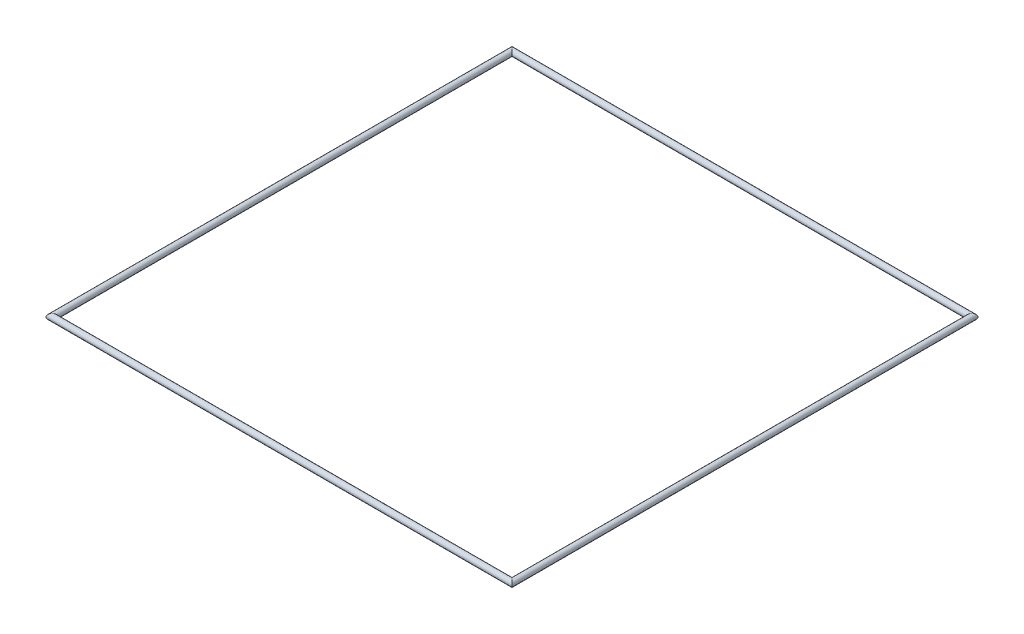
ISO-10303-21;
HEADER;
FILE_DESCRIPTION(('STEP AP214'),'2;1');
FILE_NAME('part.step','',(''),(''),'','','');
FILE_SCHEMA(('AUTOMOTIVE_DESIGN { 1 0 10303 214 1 1 1 1 }'));
ENDSEC;
DATA;
#1=APPLICATION_CONTEXT('core data for automotive mechanical design processes');
#2=APPLICATION_PROTOCOL_DEFINITION('international standard','automotive_design',2000,#1);
#3=PRODUCT_CONTEXT('',#1,'mechanical');
#4=PRODUCT('Part','Part','',(#3));
#5=PRODUCT_RELATED_PRODUCT_CATEGORY('part','',(#4));
#6=PRODUCT_DEFINITION_FORMATION('','',#4);
#7=PRODUCT_DEFINITION_CONTEXT('part definition',#1,'design');
#8=PRODUCT_DEFINITION('design','',#6,#7);
#9=PRODUCT_DEFINITION_SHAPE('','',#8);
#10=(LENGTH_UNIT() NAMED_UNIT(*) SI_UNIT(.MILLI.,.METRE.));
#11=(NAMED_UNIT(*) PLANE_ANGLE_UNIT() SI_UNIT($,.RADIAN.));
#12=(NAMED_UNIT(*) SI_UNIT($,.STERADIAN.) SOLID_ANGLE_UNIT());
#13=UNCERTAINTY_MEASURE_WITH_UNIT(LENGTH_MEASURE(1.E-05),#10,'distance_accuracy_value','');
#14=(GEOMETRIC_REPRESENTATION_CONTEXT(3) GLOBAL_UNCERTAINTY_ASSIGNED_CONTEXT((#13)) GLOBAL_UNIT_ASSIGNED_CONTEXT((#10,
#11,#12)) REPRESENTATION_CONTEXT('',''));
#15=CARTESIAN_POINT('',(0.,0.,0.));
#16=DIRECTION('',(0.,0.,1.));
#17=DIRECTION('',(1.,0.,0.));
#18=AXIS2_PLACEMENT_3D('',#15,#16,#17);
#19=CARTESIAN_POINT('',(150.,0.,-150.));
#20=DIRECTION('',(0.,0.,1.));
#21=DIRECTION('',(1.,0.,0.));
#22=AXIS2_PLACEMENT_3D('',#19,#20,#21);
#23=CYLINDRICAL_SURFACE('',#22,0.999999999999998);
#24=CARTESIAN_POINT('',(150.,0.,-150.));
#25=DIRECTION('',(-0.707106781186548,0.,-0.707106781186548));
#26=DIRECTION('',(-0.707106781186548,0.,0.707106781186548));
#27=AXIS2_PLACEMENT_3D('',#24,#25,#26);
#28=ELLIPSE('',#27,1.41421356237309,0.999999999999998);
#29=CARTESIAN_POINT('',(149.,0.,-149.));
#30=VERTEX_POINT('',#29);
#31=EDGE_CURVE('E69',#30,#30,#28,.T.);
#32=ORIENTED_EDGE('',*,*,#31,.T.);
#33=EDGE_LOOP('',(#32));
#34=FACE_BOUND('',#33,.T.);
#35=CARTESIAN_POINT('',(150.,0.,150.));
#36=DIRECTION('',(-0.707106781186548,0.,0.707106781186548));
#37=DIRECTION('',(0.707106781186548,0.,0.707106781186548));
#38=AXIS2_PLACEMENT_3D('',#35,#36,#37);
#39=ELLIPSE('',#38,1.41421356237309,0.999999999999998);
#40=CARTESIAN_POINT('',(151.,0.,151.));
#41=VERTEX_POINT('',#40);
#42=EDGE_CURVE('E59',#41,#41,#39,.T.);
#43=ORIENTED_EDGE('',*,*,#42,.T.);
#44=EDGE_LOOP('',(#43));
#45=FACE_BOUND('',#44,.T.);
#46=ADVANCED_FACE('F55',(#34,#45),#23,.F.);
#47=CARTESIAN_POINT('',(150.,0.,-150.));
#48=DIRECTION('',(0.,0.,1.));
#49=DIRECTION('',(1.,0.,0.));
#50=AXIS2_PLACEMENT_3D('',#47,#48,#49);
#51=CYLINDRICAL_SURFACE('',#50,2.);
#52=CARTESIAN_POINT('',(150.,0.,-150.));
#53=DIRECTION('',(-0.707106781186548,0.,-0.707106781186548));
#54=DIRECTION('',(-0.707106781186548,0.,0.707106781186548));
#55=AXIS2_PLACEMENT_3D('',#52,#53,#54);
#56=ELLIPSE('',#55,2.82842712474618,2.);
#57=CARTESIAN_POINT('',(148.,0.,-148.));
#58=VERTEX_POINT('',#57);
#59=EDGE_CURVE('E63',#58,#58,#56,.T.);
#60=ORIENTED_EDGE('',*,*,#59,.F.);
#61=EDGE_LOOP('',(#60));
#62=FACE_BOUND('',#61,.T.);
#63=CARTESIAN_POINT('',(150.,0.,150.));
#64=DIRECTION('',(-0.707106781186548,0.,0.707106781186548));
#65=DIRECTION('',(0.707106781186548,0.,0.707106781186548));
#66=AXIS2_PLACEMENT_3D('',#63,#64,#65);
#67=ELLIPSE('',#66,2.82842712474618,2.);
#68=CARTESIAN_POINT('',(152.,0.,152.));
#69=VERTEX_POINT('',#68);
#70=EDGE_CURVE('E12',#69,#69,#67,.T.);
#71=ORIENTED_EDGE('',*,*,#70,.F.);
#72=EDGE_LOOP('',(#71));
#73=FACE_BOUND('',#72,.T.);
#74=ADVANCED_FACE('F82',(#62,#73),#51,.T.);
#75=CARTESIAN_POINT('',(150.,0.,-150.));
#76=DIRECTION('',(-0.707106781186548,0.,-0.707106781186548));
#77=DIRECTION('',(-0.707106781186548,0.,0.707106781186548));
#78=AXIS2_PLACEMENT_3D('',#75,#76,#77);
#79=PLANE('',#78);
#80=ORIENTED_EDGE('',*,*,#31,.F.);
#81=EDGE_LOOP('',(#80));
#82=FACE_BOUND('',#81,.T.);
#83=ORIENTED_EDGE('',*,*,#59,.T.);
#84=EDGE_LOOP('',(#83));
#85=FACE_BOUND('',#84,.T.);
#86=ADVANCED_FACE('F78',(#82,#85),#79,.T.);
#87=CARTESIAN_POINT('',(150.,0.,150.));
#88=DIRECTION('',(-0.707106781186548,0.,0.707106781186548));
#89=DIRECTION('',(0.707106781186548,0.,0.707106781186548));
#90=AXIS2_PLACEMENT_3D('',#87,#88,#89);
#91=PLANE('',#90);
#92=ORIENTED_EDGE('',*,*,#42,.F.);
#93=EDGE_LOOP('',(#92));
#94=FACE_BOUND('',#93,.T.);
#95=ORIENTED_EDGE('',*,*,#70,.T.);
#96=EDGE_LOOP('',(#95));
#97=FACE_BOUND('',#96,.T.);
#98=ADVANCED_FACE('F57',(#94,#97),#91,.T.);
#99=CLOSED_SHELL('',(#46,#74,#86,#98));
#100=MANIFOLD_SOLID_BREP('B2',#99);
#101=CARTESIAN_POINT('',(150.,0.,150.));
#102=DIRECTION('',(-1.,0.,0.));
#103=DIRECTION('',(0.,0.,1.));
#104=AXIS2_PLACEMENT_3D('',#101,#102,#103);
#105=CYLINDRICAL_SURFACE('',#104,0.999999999999998);
#106=CARTESIAN_POINT('',(-150.,0.,150.));
#107=DIRECTION('',(-0.707106781186548,0.,-0.707106781186548));
#108=DIRECTION('',(-0.707106781186547,0.,0.707106781186548));
#109=AXIS2_PLACEMENT_3D('',#106,#107,#108);
#110=ELLIPSE('',#109,1.41421356237309,0.999999999999998);
#111=CARTESIAN_POINT('',(-151.,0.,151.));
#112=VERTEX_POINT('',#111);
#113=EDGE_CURVE('E168',#112,#112,#110,.T.);
#114=ORIENTED_EDGE('',*,*,#113,.T.);
#115=EDGE_LOOP('',(#114));
#116=FACE_BOUND('',#115,.T.);
#117=CARTESIAN_POINT('',(150.,0.,150.));
#118=DIRECTION('',(0.707106781186547,0.,-0.707106781186548));
#119=DIRECTION('',(-0.707106781186547,0.,-0.707106781186548));
#120=AXIS2_PLACEMENT_3D('',#117,#118,#119);
#121=ELLIPSE('',#120,1.41421356237309,0.999999999999998);
#122=CARTESIAN_POINT('',(149.,0.,149.));
#123=VERTEX_POINT('',#122);
#124=EDGE_CURVE('E156',#123,#123,#121,.T.);
#125=ORIENTED_EDGE('',*,*,#124,.T.);
#126=EDGE_LOOP('',(#125));
#127=FACE_BOUND('',#126,.T.);
#128=ADVANCED_FACE('F152',(#116,#127),#105,.F.);
#129=CARTESIAN_POINT('',(150.,0.,150.));
#130=DIRECTION('',(-1.,0.,0.));
#131=DIRECTION('',(0.,0.,1.));
#132=AXIS2_PLACEMENT_3D('',#129,#130,#131);
#133=CYLINDRICAL_SURFACE('',#132,2.);
#134=CARTESIAN_POINT('',(-150.,0.,150.));
#135=DIRECTION('',(-0.707106781186548,0.,-0.707106781186548));
#136=DIRECTION('',(-0.707106781186547,0.,0.707106781186548));
#137=AXIS2_PLACEMENT_3D('',#134,#135,#136);
#138=ELLIPSE('',#137,2.82842712474618,2.);
#139=CARTESIAN_POINT('',(-152.,0.,152.));
#140=VERTEX_POINT('',#139);
#141=EDGE_CURVE('E161',#140,#140,#138,.T.);
#142=ORIENTED_EDGE('',*,*,#141,.F.);
#143=EDGE_LOOP('',(#142));
#144=FACE_BOUND('',#143,.T.);
#145=CARTESIAN_POINT('',(150.,0.,150.));
#146=DIRECTION('',(0.707106781186547,0.,-0.707106781186548));
#147=DIRECTION('',(-0.707106781186547,0.,-0.707106781186548));
#148=AXIS2_PLACEMENT_3D('',#145,#146,#147);
#149=ELLIPSE('',#148,2.82842712474618,2.);
#150=CARTESIAN_POINT('',(148.,0.,148.));
#151=VERTEX_POINT('',#150);
#152=EDGE_CURVE('E54',#151,#151,#149,.T.);
#153=ORIENTED_EDGE('',*,*,#152,.F.);
#154=EDGE_LOOP('',(#153));
#155=FACE_BOUND('',#154,.T.);
#156=ADVANCED_FACE('F183',(#144,#155),#133,.T.);
#157=CARTESIAN_POINT('',(-150.,0.,150.));
#158=DIRECTION('',(-0.707106781186548,0.,-0.707106781186548));
#159=DIRECTION('',(-0.707106781186547,0.,0.707106781186548));
#160=AXIS2_PLACEMENT_3D('',#157,#158,#159);
#161=PLANE('',#160);
#162=ORIENTED_EDGE('',*,*,#113,.F.);
#163=EDGE_LOOP('',(#162));
#164=FACE_BOUND('',#163,.T.);
#165=ORIENTED_EDGE('',*,*,#141,.T.);
#166=EDGE_LOOP('',(#165));
#167=FACE_BOUND('',#166,.T.);
#168=ADVANCED_FACE('F179',(#164,#167),#161,.T.);
#169=CARTESIAN_POINT('',(150.,0.,150.));
#170=DIRECTION('',(0.707106781186547,0.,-0.707106781186548));
#171=DIRECTION('',(-0.707106781186547,0.,-0.707106781186548));
#172=AXIS2_PLACEMENT_3D('',#169,#170,#171);
#173=PLANE('',#172);
#174=ORIENTED_EDGE('',*,*,#124,.F.);
#175=EDGE_LOOP('',(#174));
#176=FACE_BOUND('',#175,.T.);
#177=ORIENTED_EDGE('',*,*,#152,.T.);
#178=EDGE_LOOP('',(#177));
#179=FACE_BOUND('',#178,.T.);
#180=ADVANCED_FACE('F154',(#176,#179),#173,.T.);
#181=CLOSED_SHELL('',(#128,#156,#168,#180));
#182=MANIFOLD_SOLID_BREP('B7',#181);
#183=CARTESIAN_POINT('',(-150.,0.,-150.));
#184=DIRECTION('',(1.,0.,0.));
#185=DIRECTION('',(0.,0.,-1.));
#186=AXIS2_PLACEMENT_3D('',#183,#184,#185);
#187=CYLINDRICAL_SURFACE('',#186,0.999999999999998);
#188=CARTESIAN_POINT('',(-150.,0.,-150.));
#189=DIRECTION('',(-0.707106781186547,0.,0.707106781186548));
#190=DIRECTION('',(0.707106781186548,0.,0.707106781186547));
#191=AXIS2_PLACEMENT_3D('',#188,#189,#190);
#192=ELLIPSE('',#191,1.41421356237309,0.999999999999998);
#193=CARTESIAN_POINT('',(-149.,0.,-149.));
#194=VERTEX_POINT('',#193);
#195=EDGE_CURVE('E266',#194,#194,#192,.T.);
#196=ORIENTED_EDGE('',*,*,#195,.T.);
#197=EDGE_LOOP('',(#196));
#198=FACE_BOUND('',#197,.T.);
#199=CARTESIAN_POINT('',(150.,0.,-150.));
#200=DIRECTION('',(0.707106781186548,0.,0.707106781186548));
#201=DIRECTION('',(0.707106781186547,0.,-0.707106781186548));
#202=AXIS2_PLACEMENT_3D('',#199,#200,#201);
#203=ELLIPSE('',#202,1.41421356237309,0.999999999999998);
#204=CARTESIAN_POINT('',(151.,0.,-151.));
#205=VERTEX_POINT('',#204);
#206=EDGE_CURVE('E256',#205,#205,#203,.T.);
#207=ORIENTED_EDGE('',*,*,#206,.T.);
#208=EDGE_LOOP('',(#207));
#209=FACE_BOUND('',#208,.T.);
#210=ADVANCED_FACE('F252',(#198,#209),#187,.F.);
#211=CARTESIAN_POINT('',(-150.,0.,-150.));
#212=DIRECTION('',(1.,0.,0.));
#213=DIRECTION('',(0.,0.,-1.));
#214=AXIS2_PLACEMENT_3D('',#211,#212,#213);
#215=CYLINDRICAL_SURFACE('',#214,2.);
#216=CARTESIAN_POINT('',(-150.,0.,-150.));
#217=DIRECTION('',(-0.707106781186547,0.,0.707106781186548));
#218=DIRECTION('',(0.707106781186548,0.,0.707106781186547));
#219=AXIS2_PLACEMENT_3D('',#216,#217,#218);
#220=ELLIPSE('',#219,2.82842712474618,2.);
#221=CARTESIAN_POINT('',(-148.,0.,-148.));
#222=VERTEX_POINT('',#221);
#223=EDGE_CURVE('E260',#222,#222,#220,.T.);
#224=ORIENTED_EDGE('',*,*,#223,.F.);
#225=EDGE_LOOP('',(#224));
#226=FACE_BOUND('',#225,.T.);
#227=CARTESIAN_POINT('',(150.,0.,-150.));
#228=DIRECTION('',(0.707106781186548,0.,0.707106781186548));
#229=DIRECTION('',(0.707106781186547,0.,-0.707106781186548));
#230=AXIS2_PLACEMENT_3D('',#227,#228,#229);
#231=ELLIPSE('',#230,2.82842712474618,2.);
#232=CARTESIAN_POINT('',(152.,0.,-152.));
#233=VERTEX_POINT('',#232);
#234=EDGE_CURVE('E151',#233,#233,#231,.T.);
#235=ORIENTED_EDGE('',*,*,#234,.F.);
#236=EDGE_LOOP('',(#235));
#237=FACE_BOUND('',#236,.T.);
#238=ADVANCED_FACE('F279',(#226,#237),#215,.T.);
#239=CARTESIAN_POINT('',(-150.,0.,-150.));
#240=DIRECTION('',(-0.707106781186547,0.,0.707106781186548));
#241=DIRECTION('',(0.707106781186548,0.,0.707106781186547));
#242=AXIS2_PLACEMENT_3D('',#239,#240,#241);
#243=PLANE('',#242);
#244=ORIENTED_EDGE('',*,*,#195,.F.);
#245=EDGE_LOOP('',(#244));
#246=FACE_BOUND('',#245,.T.);
#247=ORIENTED_EDGE('',*,*,#223,.T.);
#248=EDGE_LOOP('',(#247));
#249=FACE_BOUND('',#248,.T.);
#250=ADVANCED_FACE('F275',(#246,#249),#243,.T.);
#251=CARTESIAN_POINT('',(150.,0.,-150.));
#252=DIRECTION('',(0.707106781186548,0.,0.707106781186548));
#253=DIRECTION('',(0.707106781186547,0.,-0.707106781186548));
#254=AXIS2_PLACEMENT_3D('',#251,#252,#253);
#255=PLANE('',#254);
#256=ORIENTED_EDGE('',*,*,#206,.F.);
#257=EDGE_LOOP('',(#256));
#258=FACE_BOUND('',#257,.T.);
#259=ORIENTED_EDGE('',*,*,#234,.T.);
#260=EDGE_LOOP('',(#259));
#261=FACE_BOUND('',#260,.T.);
#262=ADVANCED_FACE('F254',(#258,#261),#255,.T.);
#263=CLOSED_SHELL('',(#210,#238,#250,#262));
#264=MANIFOLD_SOLID_BREP('B49',#263);
#265=CARTESIAN_POINT('',(-150.,0.,150.));
#266=DIRECTION('',(0.,0.,-1.));
#267=DIRECTION('',(-1.,0.,0.));
#268=AXIS2_PLACEMENT_3D('',#265,#266,#267);
#269=CYLINDRICAL_SURFACE('',#268,0.999999999999998);
#270=CARTESIAN_POINT('',(-150.,0.,150.));
#271=DIRECTION('',(0.707106781186548,0.,0.707106781186548));
#272=DIRECTION('',(0.707106781186548,0.,-0.707106781186548));
#273=AXIS2_PLACEMENT_3D('',#270,#271,#272);
#274=ELLIPSE('',#273,1.41421356237309,0.999999999999998);
#275=CARTESIAN_POINT('',(-149.,0.,149.));
#276=VERTEX_POINT('',#275);
#277=EDGE_CURVE('E355',#276,#276,#274,.T.);
#278=ORIENTED_EDGE('',*,*,#277,.T.);
#279=EDGE_LOOP('',(#278));
#280=FACE_BOUND('',#279,.T.);
#281=CARTESIAN_POINT('',(-150.,0.,-150.));
#282=DIRECTION('',(0.707106781186547,0.,-0.707106781186548));
#283=DIRECTION('',(-0.707106781186548,0.,-0.707106781186548));
#284=AXIS2_PLACEMENT_3D('',#281,#282,#283);
#285=ELLIPSE('',#284,1.41421356237309,0.999999999999998);
#286=CARTESIAN_POINT('',(-151.,0.,-151.));
#287=VERTEX_POINT('',#286);
#288=EDGE_CURVE('E345',#287,#287,#285,.T.);
#289=ORIENTED_EDGE('',*,*,#288,.T.);
#290=EDGE_LOOP('',(#289));
#291=FACE_BOUND('',#290,.T.);
#292=ADVANCED_FACE('F341',(#280,#291),#269,.F.);
#293=CARTESIAN_POINT('',(-150.,0.,150.));
#294=DIRECTION('',(0.,0.,-1.));
#295=DIRECTION('',(-1.,0.,0.));
#296=AXIS2_PLACEMENT_3D('',#293,#294,#295);
#297=CYLINDRICAL_SURFACE('',#296,2.);
#298=CARTESIAN_POINT('',(-150.,0.,150.));
#299=DIRECTION('',(0.707106781186548,0.,0.707106781186548));
#300=DIRECTION('',(0.707106781186548,0.,-0.707106781186548));
#301=AXIS2_PLACEMENT_3D('',#298,#299,#300);
#302=ELLIPSE('',#301,2.82842712474618,2.);
#303=CARTESIAN_POINT('',(-148.,0.,148.));
#304=VERTEX_POINT('',#303);
#305=EDGE_CURVE('E349',#304,#304,#302,.T.);
#306=ORIENTED_EDGE('',*,*,#305,.F.);
#307=EDGE_LOOP('',(#306));
#308=FACE_BOUND('',#307,.T.);
#309=CARTESIAN_POINT('',(-150.,0.,-150.));
#310=DIRECTION('',(0.707106781186547,0.,-0.707106781186548));
#311=DIRECTION('',(-0.707106781186548,0.,-0.707106781186548));
#312=AXIS2_PLACEMENT_3D('',#309,#310,#311);
#313=ELLIPSE('',#312,2.82842712474618,2.);
#314=CARTESIAN_POINT('',(-152.,0.,-152.));
#315=VERTEX_POINT('',#314);
#316=EDGE_CURVE('E251',#315,#315,#313,.T.);
#317=ORIENTED_EDGE('',*,*,#316,.F.);
#318=EDGE_LOOP('',(#317));
#319=FACE_BOUND('',#318,.T.);
#320=ADVANCED_FACE('F368',(#308,#319),#297,.T.);
#321=CARTESIAN_POINT('',(-150.,0.,150.));
#322=DIRECTION('',(0.707106781186548,0.,0.707106781186548));
#323=DIRECTION('',(0.707106781186548,0.,-0.707106781186548));
#324=AXIS2_PLACEMENT_3D('',#321,#322,#323);
#325=PLANE('',#324);
#326=ORIENTED_EDGE('',*,*,#277,.F.);
#327=EDGE_LOOP('',(#326));
#328=FACE_BOUND('',#327,.T.);
#329=ORIENTED_EDGE('',*,*,#305,.T.);
#330=EDGE_LOOP('',(#329));
#331=FACE_BOUND('',#330,.T.);
#332=ADVANCED_FACE('F364',(#328,#331),#325,.T.);
#333=CARTESIAN_POINT('',(-150.,0.,-150.));
#334=DIRECTION('',(0.707106781186547,0.,-0.707106781186548));
#335=DIRECTION('',(-0.707106781186548,0.,-0.707106781186548));
#336=AXIS2_PLACEMENT_3D('',#333,#334,#335);
#337=PLANE('',#336);
#338=ORIENTED_EDGE('',*,*,#288,.F.);
#339=EDGE_LOOP('',(#338));
#340=FACE_BOUND('',#339,.T.);
#341=ORIENTED_EDGE('',*,*,#316,.T.);
#342=EDGE_LOOP('',(#341));
#343=FACE_BOUND('',#342,.T.);
#344=ADVANCED_FACE('F343',(#340,#343),#337,.T.);
#345=CLOSED_SHELL('',(#292,#320,#332,#344));
#346=MANIFOLD_SOLID_BREP('B146',#345);
#347=ADVANCED_BREP_SHAPE_REPRESENTATION('',(#18,#100,#182,#264,#346),#14);
#348=SHAPE_DEFINITION_REPRESENTATION(#9,#347);
ENDSEC;
END-ISO-10303-21;
